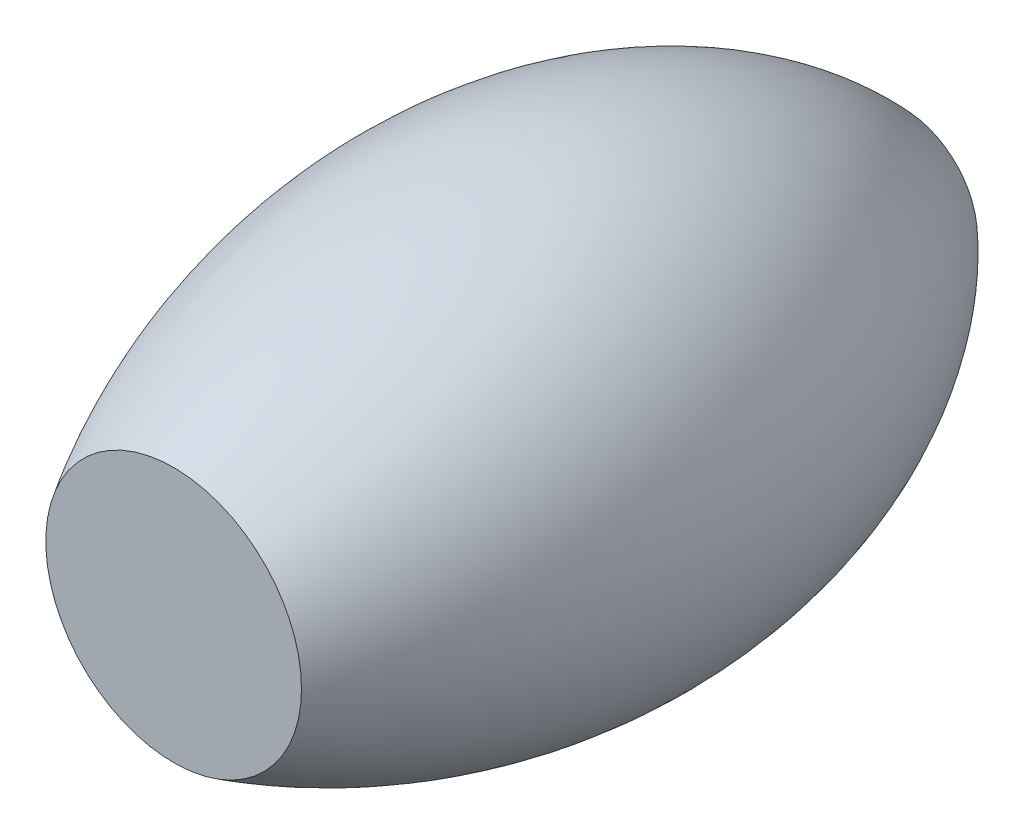
ISO-10303-21;
HEADER;
FILE_DESCRIPTION(('STEP AP214'),'2;1');
FILE_NAME('part.step','',(''),(''),'','','');
FILE_SCHEMA(('AUTOMOTIVE_DESIGN { 1 0 10303 214 1 1 1 1 }'));
ENDSEC;
DATA;
#1=APPLICATION_CONTEXT('core data for automotive mechanical design processes');
#2=APPLICATION_PROTOCOL_DEFINITION('international standard','automotive_design',2000,#1);
#3=PRODUCT_CONTEXT('',#1,'mechanical');
#4=PRODUCT('Part','Part','',(#3));
#5=PRODUCT_RELATED_PRODUCT_CATEGORY('part','',(#4));
#6=PRODUCT_DEFINITION_FORMATION('','',#4);
#7=PRODUCT_DEFINITION_CONTEXT('part definition',#1,'design');
#8=PRODUCT_DEFINITION('design','',#6,#7);
#9=PRODUCT_DEFINITION_SHAPE('','',#8);
#10=(LENGTH_UNIT() NAMED_UNIT(*) SI_UNIT(.MILLI.,.METRE.));
#11=(NAMED_UNIT(*) PLANE_ANGLE_UNIT() SI_UNIT($,.RADIAN.));
#12=(NAMED_UNIT(*) SI_UNIT($,.STERADIAN.) SOLID_ANGLE_UNIT());
#13=UNCERTAINTY_MEASURE_WITH_UNIT(LENGTH_MEASURE(1.E-05),#10,'distance_accuracy_value','');
#14=(GEOMETRIC_REPRESENTATION_CONTEXT(3) GLOBAL_UNCERTAINTY_ASSIGNED_CONTEXT((#13)) GLOBAL_UNIT_ASSIGNED_CONTEXT((#10,
#11,#12)) REPRESENTATION_CONTEXT('',''));
#15=CARTESIAN_POINT('',(0.,0.,0.));
#16=DIRECTION('',(0.,0.,1.));
#17=DIRECTION('',(1.,0.,0.));
#18=AXIS2_PLACEMENT_3D('',#15,#16,#17);
#19=CARTESIAN_POINT('',(0.,0.,-100.));
#20=DIRECTION('',(0.,0.,1.));
#21=DIRECTION('',(1.,0.,0.));
#22=AXIS2_PLACEMENT_3D('',#19,#20,#21);
#23=PLANE('',#22);
#24=CARTESIAN_POINT('',(0.,0.,-100.));
#25=DIRECTION('',(0.,0.,1.));
#26=DIRECTION('',(1.,0.,0.));
#27=AXIS2_PLACEMENT_3D('',#24,#25,#26);
#28=CIRCLE('',#27,20.);
#29=CARTESIAN_POINT('',(20.,0.,-100.));
#30=VERTEX_POINT('',#29);
#31=EDGE_CURVE('E10',#30,#30,#28,.T.);
#32=ORIENTED_EDGE('',*,*,#31,.F.);
#33=EDGE_LOOP('',(#32));
#34=FACE_BOUND('',#33,.T.);
#35=ADVANCED_FACE('F35',(#34),#23,.F.);
#36=CARTESIAN_POINT('',(-20.,0.,-100.));
#37=CARTESIAN_POINT('',(-48.5599913593067,0.,-74.1002951234835));
#38=CARTESIAN_POINT('',(-74.0191401957353,0.,-2.1092780069956));
#39=CARTESIAN_POINT('',(-53.1786552059931,0.,70.2058579518701));
#40=CARTESIAN_POINT('',(-35.,0.,100.));
#41=B_SPLINE_CURVE_WITH_KNOTS('',3,(#36,#37,#38,#39,#40),.UNSPECIFIED.,.F.,.F.,(4,1,4),(0.,
0.514054731750555,1.),.UNSPECIFIED.);
#42=CARTESIAN_POINT('',(0.,0.,100.));
#43=DIRECTION('',(0.,0.,1.));
#44=AXIS1_PLACEMENT('',#42,#43);
#45=SURFACE_OF_REVOLUTION('',#41,#44);
#46=CARTESIAN_POINT('',(0.,0.,100.));
#47=DIRECTION('',(0.,0.,1.));
#48=DIRECTION('',(1.,0.,0.));
#49=AXIS2_PLACEMENT_3D('',#46,#47,#48);
#50=CIRCLE('',#49,35.);
#51=CARTESIAN_POINT('',(35.,0.,100.));
#52=VERTEX_POINT('',#51);
#53=EDGE_CURVE('E41',#52,#52,#50,.T.);
#54=ORIENTED_EDGE('',*,*,#53,.F.);
#55=EDGE_LOOP('',(#54));
#56=FACE_BOUND('',#55,.T.);
#57=ORIENTED_EDGE('',*,*,#31,.T.);
#58=EDGE_LOOP('',(#57));
#59=FACE_BOUND('',#58,.T.);
#60=ADVANCED_FACE('F54',(#56,#59),#45,.T.);
#61=CARTESIAN_POINT('',(0.,0.,100.));
#62=DIRECTION('',(0.,0.,1.));
#63=DIRECTION('',(1.,0.,0.));
#64=AXIS2_PLACEMENT_3D('',#61,#62,#63);
#65=PLANE('',#64);
#66=ORIENTED_EDGE('',*,*,#53,.T.);
#67=EDGE_LOOP('',(#66));
#68=FACE_BOUND('',#67,.T.);
#69=ADVANCED_FACE('F57',(#68),#65,.T.);
#70=CLOSED_SHELL('',(#35,#60,#69));
#71=MANIFOLD_SOLID_BREP('B2',#70);
#72=ADVANCED_BREP_SHAPE_REPRESENTATION('',(#18,#71),#14);
#73=SHAPE_DEFINITION_REPRESENTATION(#9,#72);
ENDSEC;
END-ISO-10303-21;
